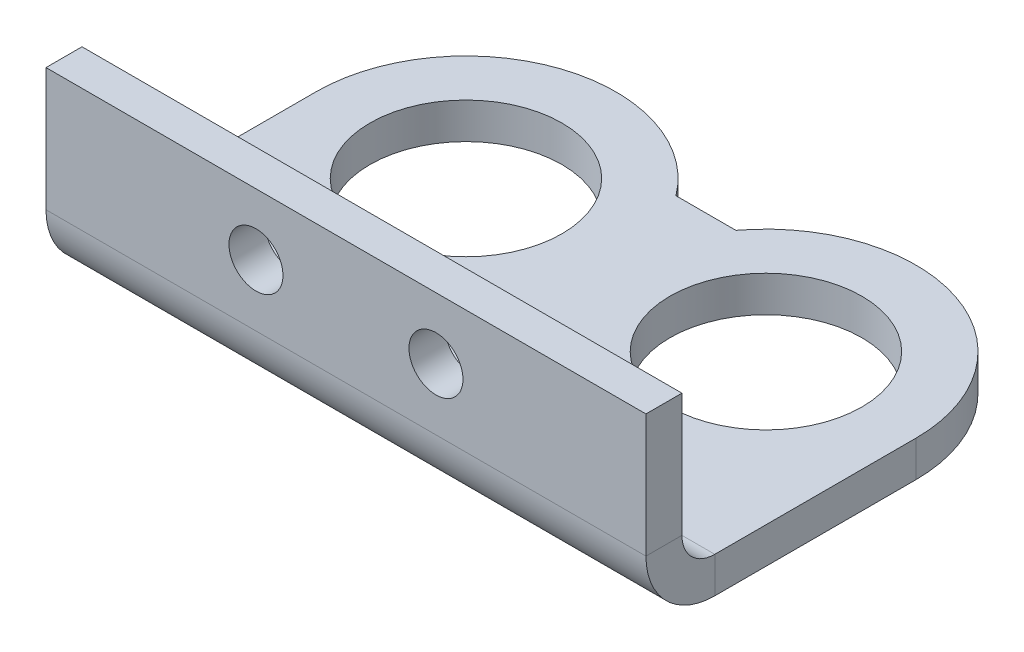
ISO-10303-21;
HEADER;
FILE_DESCRIPTION(('STEP AP214'),'2;1');
FILE_NAME('part.step','',(''),(''),'','','');
FILE_SCHEMA(('AUTOMOTIVE_DESIGN { 1 0 10303 214 1 1 1 1 }'));
ENDSEC;
DATA;
#1=APPLICATION_CONTEXT('core data for automotive mechanical design processes');
#2=APPLICATION_PROTOCOL_DEFINITION('international standard','automotive_design',2000,#1);
#3=PRODUCT_CONTEXT('',#1,'mechanical');
#4=PRODUCT('Part','Part','',(#3));
#5=PRODUCT_RELATED_PRODUCT_CATEGORY('part','',(#4));
#6=PRODUCT_DEFINITION_FORMATION('','',#4);
#7=PRODUCT_DEFINITION_CONTEXT('part definition',#1,'design');
#8=PRODUCT_DEFINITION('design','',#6,#7);
#9=PRODUCT_DEFINITION_SHAPE('','',#8);
#10=(LENGTH_UNIT() NAMED_UNIT(*) SI_UNIT(.MILLI.,.METRE.));
#11=(NAMED_UNIT(*) PLANE_ANGLE_UNIT() SI_UNIT($,.RADIAN.));
#12=(NAMED_UNIT(*) SI_UNIT($,.STERADIAN.) SOLID_ANGLE_UNIT());
#13=UNCERTAINTY_MEASURE_WITH_UNIT(LENGTH_MEASURE(1.E-05),#10,'distance_accuracy_value','');
#14=(GEOMETRIC_REPRESENTATION_CONTEXT(3) GLOBAL_UNCERTAINTY_ASSIGNED_CONTEXT((#13)) GLOBAL_UNIT_ASSIGNED_CONTEXT((#10,
#11,#12)) REPRESENTATION_CONTEXT('',''));
#15=CARTESIAN_POINT('',(0.,0.,0.));
#16=DIRECTION('',(0.,0.,1.));
#17=DIRECTION('',(1.,0.,0.));
#18=AXIS2_PLACEMENT_3D('',#15,#16,#17);
#19=CARTESIAN_POINT('',(25.,-3.,-22.5));
#20=DIRECTION('',(1.,0.,0.));
#21=DIRECTION('',(0.,0.,-1.));
#22=AXIS2_PLACEMENT_3D('',#19,#20,#21);
#23=PLANE('',#22);
#24=DIRECTION('',(0.,0.,-1.));
#25=VECTOR('',#24,1.);
#26=CARTESIAN_POINT('',(25.,0.,-22.5));
#27=LINE('',#26,#25);
#28=CARTESIAN_POINT('',(25.,0.,-5.7366));
#29=VERTEX_POINT('',#28);
#30=CARTESIAN_POINT('',(25.,0.,-22.5));
#31=VERTEX_POINT('',#30);
#32=EDGE_CURVE('E242',#29,#31,#27,.T.);
#33=ORIENTED_EDGE('',*,*,#32,.F.);
#34=DIRECTION('',(0.,-1.,0.));
#35=VECTOR('',#34,1.);
#36=CARTESIAN_POINT('',(25.,0.,-5.73659999999999));
#37=LINE('',#36,#35);
#38=CARTESIAN_POINT('',(25.,-3.00000000000001,-5.73659999999999));
#39=VERTEX_POINT('',#38);
#40=EDGE_CURVE('E202',#29,#39,#37,.T.);
#41=ORIENTED_EDGE('',*,*,#40,.T.);
#42=DIRECTION('',(0.,0.,-1.));
#43=VECTOR('',#42,1.);
#44=CARTESIAN_POINT('',(25.,-3.,-22.5));
#45=LINE('',#44,#43);
#46=CARTESIAN_POINT('',(25.,-3.,-22.5));
#47=VERTEX_POINT('',#46);
#48=EDGE_CURVE('E231',#39,#47,#45,.T.);
#49=ORIENTED_EDGE('',*,*,#48,.T.);
#50=DIRECTION('',(0.,1.,0.));
#51=VECTOR('',#50,1.);
#52=CARTESIAN_POINT('',(25.,-3.,-22.5));
#53=LINE('',#52,#51);
#54=EDGE_CURVE('E250',#47,#31,#53,.T.);
#55=ORIENTED_EDGE('',*,*,#54,.T.);
#56=EDGE_LOOP('',(#33,#41,#49,#55));
#57=FACE_BOUND('',#56,.T.);
#58=ADVANCED_FACE('F57',(#57),#23,.T.);
#59=CARTESIAN_POINT('',(-12.5,-3.,-22.5));
#60=DIRECTION('',(0.,1.,0.));
#61=DIRECTION('',(0.,0.,1.));
#62=AXIS2_PLACEMENT_3D('',#59,#60,#61);
#63=PLANE('',#62);
#64=CARTESIAN_POINT('',(-12.5,-3.,-22.5));
#65=DIRECTION('',(0.,1.,0.));
#66=DIRECTION('',(0.,0.,1.));
#67=AXIS2_PLACEMENT_3D('',#64,#65,#66);
#68=CIRCLE('',#67,8.);
#69=CARTESIAN_POINT('',(-12.5,-3.,-14.5));
#70=VERTEX_POINT('',#69);
#71=EDGE_CURVE('E220',#70,#70,#68,.T.);
#72=ORIENTED_EDGE('',*,*,#71,.T.);
#73=EDGE_LOOP('',(#72));
#74=FACE_BOUND('',#73,.T.);
#75=CARTESIAN_POINT('',(12.5,-3.,-22.5));
#76=DIRECTION('',(0.,1.,0.));
#77=DIRECTION('',(0.,0.,-1.));
#78=AXIS2_PLACEMENT_3D('',#75,#76,#77);
#79=CIRCLE('',#78,8.);
#80=CARTESIAN_POINT('',(12.5,-3.,-30.5));
#81=VERTEX_POINT('',#80);
#82=EDGE_CURVE('E214',#81,#81,#79,.T.);
#83=ORIENTED_EDGE('',*,*,#82,.T.);
#84=EDGE_LOOP('',(#83));
#85=FACE_BOUND('',#84,.T.);
#86=DIRECTION('',(1.,0.,0.));
#87=VECTOR('',#86,1.);
#88=CARTESIAN_POINT('',(25.,-3.00000000000001,-5.73659999999999));
#89=LINE('',#88,#87);
#90=CARTESIAN_POINT('',(-25.,-3.,-5.73659999999999));
#91=VERTEX_POINT('',#90);
#92=EDGE_CURVE('E151',#39,#91,#89,.F.);
#93=ORIENTED_EDGE('',*,*,#92,.T.);
#94=DIRECTION('',(0.,0.,1.));
#95=VECTOR('',#94,1.);
#96=CARTESIAN_POINT('',(-25.,-3.,-22.5));
#97=LINE('',#96,#95);
#98=CARTESIAN_POINT('',(-25.,-3.,-22.5));
#99=VERTEX_POINT('',#98);
#100=EDGE_CURVE('E228',#99,#91,#97,.T.);
#101=ORIENTED_EDGE('',*,*,#100,.F.);
#102=CARTESIAN_POINT('',(-12.5,-3.,-22.5));
#103=DIRECTION('',(0.,1.,0.));
#104=DIRECTION('',(0.,0.,1.));
#105=AXIS2_PLACEMENT_3D('',#102,#103,#104);
#106=CIRCLE('',#105,12.5);
#107=CARTESIAN_POINT('',(-2.5,-3.,-30.));
#108=VERTEX_POINT('',#107);
#109=EDGE_CURVE('E226',#108,#99,#106,.T.);
#110=ORIENTED_EDGE('',*,*,#109,.F.);
#111=DIRECTION('',(-1.,0.,0.));
#112=VECTOR('',#111,1.);
#113=CARTESIAN_POINT('',(-2.5,-3.,-30.));
#114=LINE('',#113,#112);
#115=CARTESIAN_POINT('',(2.5,-3.,-30.));
#116=VERTEX_POINT('',#115);
#117=EDGE_CURVE('E236',#116,#108,#114,.T.);
#118=ORIENTED_EDGE('',*,*,#117,.F.);
#119=CARTESIAN_POINT('',(12.5,-3.,-22.5));
#120=DIRECTION('',(0.,1.,0.));
#121=DIRECTION('',(0.,0.,-1.));
#122=AXIS2_PLACEMENT_3D('',#119,#120,#121);
#123=CIRCLE('',#122,12.5);
#124=EDGE_CURVE('E233',#47,#116,#123,.T.);
#125=ORIENTED_EDGE('',*,*,#124,.F.);
#126=ORIENTED_EDGE('',*,*,#48,.F.);
#127=EDGE_LOOP('',(#93,#101,#110,#118,#125,#126));
#128=FACE_BOUND('',#127,.T.);
#129=ADVANCED_FACE('F289',(#74,#85,#128),#63,.F.);
#130=CARTESIAN_POINT('',(-12.5,0.,-22.5));
#131=DIRECTION('',(0.,1.,0.));
#132=DIRECTION('',(0.,0.,1.));
#133=AXIS2_PLACEMENT_3D('',#130,#131,#132);
#134=PLANE('',#133);
#135=CARTESIAN_POINT('',(12.5,0.,-22.5));
#136=DIRECTION('',(0.,1.,0.));
#137=DIRECTION('',(0.,0.,-1.));
#138=AXIS2_PLACEMENT_3D('',#135,#136,#137);
#139=CIRCLE('',#138,8.);
#140=CARTESIAN_POINT('',(12.5,0.,-30.5));
#141=VERTEX_POINT('',#140);
#142=EDGE_CURVE('E211',#141,#141,#139,.T.);
#143=ORIENTED_EDGE('',*,*,#142,.F.);
#144=EDGE_LOOP('',(#143));
#145=FACE_BOUND('',#144,.T.);
#146=CARTESIAN_POINT('',(-12.5,0.,-22.5));
#147=DIRECTION('',(0.,1.,0.));
#148=DIRECTION('',(0.,0.,1.));
#149=AXIS2_PLACEMENT_3D('',#146,#147,#148);
#150=CIRCLE('',#149,8.);
#151=CARTESIAN_POINT('',(-12.5,0.,-14.5));
#152=VERTEX_POINT('',#151);
#153=EDGE_CURVE('E217',#152,#152,#150,.T.);
#154=ORIENTED_EDGE('',*,*,#153,.F.);
#155=EDGE_LOOP('',(#154));
#156=FACE_BOUND('',#155,.T.);
#157=DIRECTION('',(0.,0.,1.));
#158=VECTOR('',#157,1.);
#159=CARTESIAN_POINT('',(-25.,0.,-22.5));
#160=LINE('',#159,#158);
#161=CARTESIAN_POINT('',(-25.,0.,-22.5));
#162=VERTEX_POINT('',#161);
#163=CARTESIAN_POINT('',(-25.,0.,-5.73659999999999));
#164=VERTEX_POINT('',#163);
#165=EDGE_CURVE('E240',#162,#164,#160,.T.);
#166=ORIENTED_EDGE('',*,*,#165,.T.);
#167=DIRECTION('',(1.,0.,0.));
#168=VECTOR('',#167,1.);
#169=CARTESIAN_POINT('',(25.,0.,-5.73659999999999));
#170=LINE('',#169,#168);
#171=EDGE_CURVE('E74',#29,#164,#170,.F.);
#172=ORIENTED_EDGE('',*,*,#171,.F.);
#173=ORIENTED_EDGE('',*,*,#32,.T.);
#174=CARTESIAN_POINT('',(12.5,0.,-22.5));
#175=DIRECTION('',(0.,1.,0.));
#176=DIRECTION('',(0.,0.,-1.));
#177=AXIS2_PLACEMENT_3D('',#174,#175,#176);
#178=CIRCLE('',#177,12.5);
#179=CARTESIAN_POINT('',(2.5,0.,-30.));
#180=VERTEX_POINT('',#179);
#181=EDGE_CURVE('E244',#31,#180,#178,.T.);
#182=ORIENTED_EDGE('',*,*,#181,.T.);
#183=DIRECTION('',(-1.,0.,0.));
#184=VECTOR('',#183,1.);
#185=CARTESIAN_POINT('',(-2.5,0.,-30.));
#186=LINE('',#185,#184);
#187=CARTESIAN_POINT('',(-2.5,0.,-30.));
#188=VERTEX_POINT('',#187);
#189=EDGE_CURVE('E229',#180,#188,#186,.T.);
#190=ORIENTED_EDGE('',*,*,#189,.T.);
#191=CARTESIAN_POINT('',(-12.5,0.,-22.5));
#192=DIRECTION('',(0.,1.,0.));
#193=DIRECTION('',(0.,0.,1.));
#194=AXIS2_PLACEMENT_3D('',#191,#192,#193);
#195=CIRCLE('',#194,12.5);
#196=EDGE_CURVE('E223',#188,#162,#195,.T.);
#197=ORIENTED_EDGE('',*,*,#196,.T.);
#198=EDGE_LOOP('',(#166,#172,#173,#182,#190,#197));
#199=FACE_BOUND('',#198,.T.);
#200=ADVANCED_FACE('F295',(#145,#156,#199),#134,.T.);
#201=CARTESIAN_POINT('',(-12.5,-3.,-22.5));
#202=DIRECTION('',(0.,1.,0.));
#203=DIRECTION('',(0.,0.,1.));
#204=AXIS2_PLACEMENT_3D('',#201,#202,#203);
#205=CYLINDRICAL_SURFACE('',#204,12.5);
#206=ORIENTED_EDGE('',*,*,#196,.F.);
#207=DIRECTION('',(0.,1.,0.));
#208=VECTOR('',#207,1.);
#209=CARTESIAN_POINT('',(-2.5,-3.,-30.));
#210=LINE('',#209,#208);
#211=EDGE_CURVE('E13',#108,#188,#210,.T.);
#212=ORIENTED_EDGE('',*,*,#211,.F.);
#213=ORIENTED_EDGE('',*,*,#109,.T.);
#214=DIRECTION('',(0.,1.,0.));
#215=VECTOR('',#214,1.);
#216=CARTESIAN_POINT('',(-25.,-3.,-22.5));
#217=LINE('',#216,#215);
#218=EDGE_CURVE('E106',#99,#162,#217,.T.);
#219=ORIENTED_EDGE('',*,*,#218,.T.);
#220=EDGE_LOOP('',(#206,#212,#213,#219));
#221=FACE_BOUND('',#220,.T.);
#222=ADVANCED_FACE('F59',(#221),#205,.T.);
#223=CARTESIAN_POINT('',(-2.5,-3.,-30.));
#224=DIRECTION('',(0.,0.,-1.));
#225=DIRECTION('',(-1.,0.,0.));
#226=AXIS2_PLACEMENT_3D('',#223,#224,#225);
#227=PLANE('',#226);
#228=ORIENTED_EDGE('',*,*,#189,.F.);
#229=DIRECTION('',(0.,1.,0.));
#230=VECTOR('',#229,1.);
#231=CARTESIAN_POINT('',(2.5,-3.,-30.));
#232=LINE('',#231,#230);
#233=EDGE_CURVE('E66',#116,#180,#232,.T.);
#234=ORIENTED_EDGE('',*,*,#233,.F.);
#235=ORIENTED_EDGE('',*,*,#117,.T.);
#236=ORIENTED_EDGE('',*,*,#211,.T.);
#237=EDGE_LOOP('',(#228,#234,#235,#236));
#238=FACE_BOUND('',#237,.T.);
#239=ADVANCED_FACE('F311',(#238),#227,.T.);
#240=CARTESIAN_POINT('',(12.5,-3.,-22.5));
#241=DIRECTION('',(0.,1.,0.));
#242=DIRECTION('',(0.,0.,1.));
#243=AXIS2_PLACEMENT_3D('',#240,#241,#242);
#244=CYLINDRICAL_SURFACE('',#243,12.5);
#245=ORIENTED_EDGE('',*,*,#181,.F.);
#246=ORIENTED_EDGE('',*,*,#54,.F.);
#247=ORIENTED_EDGE('',*,*,#124,.T.);
#248=ORIENTED_EDGE('',*,*,#233,.T.);
#249=EDGE_LOOP('',(#245,#246,#247,#248));
#250=FACE_BOUND('',#249,.T.);
#251=ADVANCED_FACE('F299',(#250),#244,.T.);
#252=CARTESIAN_POINT('',(-25.,-3.,-22.5));
#253=DIRECTION('',(-1.,0.,0.));
#254=DIRECTION('',(0.,0.,1.));
#255=AXIS2_PLACEMENT_3D('',#252,#253,#254);
#256=PLANE('',#255);
#257=DIRECTION('',(0.,-1.,0.));
#258=VECTOR('',#257,1.);
#259=CARTESIAN_POINT('',(-25.,0.,-5.73659999999999));
#260=LINE('',#259,#258);
#261=EDGE_CURVE('E208',#164,#91,#260,.T.);
#262=ORIENTED_EDGE('',*,*,#261,.F.);
#263=ORIENTED_EDGE('',*,*,#165,.F.);
#264=ORIENTED_EDGE('',*,*,#218,.F.);
#265=ORIENTED_EDGE('',*,*,#100,.T.);
#266=EDGE_LOOP('',(#262,#263,#264,#265));
#267=FACE_BOUND('',#266,.T.);
#268=ADVANCED_FACE('F301',(#267),#256,.T.);
#269=CARTESIAN_POINT('',(-12.5,-3.,-22.5));
#270=DIRECTION('',(0.,1.,0.));
#271=DIRECTION('',(0.,0.,1.));
#272=AXIS2_PLACEMENT_3D('',#269,#270,#271);
#273=CYLINDRICAL_SURFACE('',#272,8.);
#274=ORIENTED_EDGE('',*,*,#71,.F.);
#275=EDGE_LOOP('',(#274));
#276=FACE_BOUND('',#275,.T.);
#277=ORIENTED_EDGE('',*,*,#153,.T.);
#278=EDGE_LOOP('',(#277));
#279=FACE_BOUND('',#278,.T.);
#280=ADVANCED_FACE('F303',(#276,#279),#273,.F.);
#281=CARTESIAN_POINT('',(12.5,-3.,-22.5));
#282=DIRECTION('',(0.,1.,0.));
#283=DIRECTION('',(0.,0.,1.));
#284=AXIS2_PLACEMENT_3D('',#281,#282,#283);
#285=CYLINDRICAL_SURFACE('',#284,8.);
#286=ORIENTED_EDGE('',*,*,#82,.F.);
#287=EDGE_LOOP('',(#286));
#288=FACE_BOUND('',#287,.T.);
#289=ORIENTED_EDGE('',*,*,#142,.T.);
#290=EDGE_LOOP('',(#289));
#291=FACE_BOUND('',#290,.T.);
#292=ADVANCED_FACE('F308',(#288,#291),#285,.F.);
#293=CARTESIAN_POINT('',(-25.,2.73659999999999,-5.73659999999999));
#294=DIRECTION('',(-1.,0.,0.));
#295=DIRECTION('',(0.,0.,1.));
#296=AXIS2_PLACEMENT_3D('',#293,#294,#295);
#297=PLANE('',#296);
#298=DIRECTION('',(0.,0.,1.));
#299=VECTOR('',#298,1.);
#300=CARTESIAN_POINT('',(-25.,2.73659999999999,0.));
#301=LINE('',#300,#299);
#302=CARTESIAN_POINT('',(-25.,2.73659999999998,-2.99999999999999));
#303=VERTEX_POINT('',#302);
#304=CARTESIAN_POINT('',(-25.,2.73659999999997,0.));
#305=VERTEX_POINT('',#304);
#306=EDGE_CURVE('E196',#303,#305,#301,.T.);
#307=ORIENTED_EDGE('',*,*,#306,.F.);
#308=CARTESIAN_POINT('',(-25.,2.73659999999999,-5.73659999999999));
#309=DIRECTION('',(1.,0.,0.));
#310=DIRECTION('',(0.,0.,-1.));
#311=AXIS2_PLACEMENT_3D('',#308,#309,#310);
#312=CIRCLE('',#311,2.7366);
#313=EDGE_CURVE('E154',#164,#303,#312,.F.);
#314=ORIENTED_EDGE('',*,*,#313,.F.);
#315=ORIENTED_EDGE('',*,*,#261,.T.);
#316=CARTESIAN_POINT('',(-25.,2.73659999999999,-5.73659999999999));
#317=DIRECTION('',(1.,0.,0.));
#318=DIRECTION('',(0.,0.,-1.));
#319=AXIS2_PLACEMENT_3D('',#316,#317,#318);
#320=CIRCLE('',#319,5.7366);
#321=EDGE_CURVE('E201',#91,#305,#320,.F.);
#322=ORIENTED_EDGE('',*,*,#321,.T.);
#323=EDGE_LOOP('',(#307,#314,#315,#322));
#324=FACE_BOUND('',#323,.T.);
#325=ADVANCED_FACE('F276',(#324),#297,.T.);
#326=CARTESIAN_POINT('',(25.,2.73659999999999,-5.73659999999999));
#327=DIRECTION('',(-1.,0.,0.));
#328=DIRECTION('',(0.,0.,1.));
#329=AXIS2_PLACEMENT_3D('',#326,#327,#328);
#330=PLANE('',#329);
#331=CARTESIAN_POINT('',(25.,2.73659999999999,-5.73659999999999));
#332=DIRECTION('',(1.,0.,0.));
#333=DIRECTION('',(0.,0.,-1.));
#334=AXIS2_PLACEMENT_3D('',#331,#332,#333);
#335=CIRCLE('',#334,2.7366);
#336=CARTESIAN_POINT('',(25.,2.73659999999998,-2.99999999999999));
#337=VERTEX_POINT('',#336);
#338=EDGE_CURVE('E161',#337,#29,#335,.T.);
#339=ORIENTED_EDGE('',*,*,#338,.F.);
#340=DIRECTION('',(0.,0.,1.));
#341=VECTOR('',#340,1.);
#342=CARTESIAN_POINT('',(25.,2.73659999999999,-2.99999999999999));
#343=LINE('',#342,#341);
#344=CARTESIAN_POINT('',(25.,2.73659999999999,0.));
#345=VERTEX_POINT('',#344);
#346=EDGE_CURVE('E158',#337,#345,#343,.T.);
#347=ORIENTED_EDGE('',*,*,#346,.T.);
#348=CARTESIAN_POINT('',(25.,2.73659999999999,-5.73659999999999));
#349=DIRECTION('',(1.,0.,0.));
#350=DIRECTION('',(0.,0.,-1.));
#351=AXIS2_PLACEMENT_3D('',#348,#349,#350);
#352=CIRCLE('',#351,5.7366);
#353=EDGE_CURVE('E144',#345,#39,#352,.T.);
#354=ORIENTED_EDGE('',*,*,#353,.T.);
#355=ORIENTED_EDGE('',*,*,#40,.F.);
#356=EDGE_LOOP('',(#339,#347,#354,#355));
#357=FACE_BOUND('',#356,.T.);
#358=ADVANCED_FACE('F159',(#357),#330,.F.);
#359=CARTESIAN_POINT('',(25.,2.73659999999999,-5.73659999999999));
#360=DIRECTION('',(1.,0.,0.));
#361=DIRECTION('',(0.,0.,1.));
#362=AXIS2_PLACEMENT_3D('',#359,#360,#361);
#363=CYLINDRICAL_SURFACE('',#362,5.7366);
#364=ORIENTED_EDGE('',*,*,#92,.F.);
#365=ORIENTED_EDGE('',*,*,#353,.F.);
#366=DIRECTION('',(1.,0.,0.));
#367=VECTOR('',#366,1.);
#368=CARTESIAN_POINT('',(0.,2.73659999999999,0.));
#369=LINE('',#368,#367);
#370=EDGE_CURVE('E149',#305,#345,#369,.T.);
#371=ORIENTED_EDGE('',*,*,#370,.F.);
#372=ORIENTED_EDGE('',*,*,#321,.F.);
#373=EDGE_LOOP('',(#364,#365,#371,#372));
#374=FACE_BOUND('',#373,.T.);
#375=ADVANCED_FACE('F146',(#374),#363,.T.);
#376=CARTESIAN_POINT('',(25.,2.73659999999999,-5.73659999999999));
#377=DIRECTION('',(1.,0.,0.));
#378=DIRECTION('',(0.,0.,1.));
#379=AXIS2_PLACEMENT_3D('',#376,#377,#378);
#380=CYLINDRICAL_SURFACE('',#379,2.7366);
#381=ORIENTED_EDGE('',*,*,#171,.T.);
#382=ORIENTED_EDGE('',*,*,#313,.T.);
#383=DIRECTION('',(-1.,0.,0.));
#384=VECTOR('',#383,1.);
#385=CARTESIAN_POINT('',(-25.,2.73659999999999,-2.99999999999999));
#386=LINE('',#385,#384);
#387=EDGE_CURVE('E166',#303,#337,#386,.F.);
#388=ORIENTED_EDGE('',*,*,#387,.T.);
#389=ORIENTED_EDGE('',*,*,#338,.T.);
#390=EDGE_LOOP('',(#381,#382,#388,#389));
#391=FACE_BOUND('',#390,.T.);
#392=ADVANCED_FACE('F278',(#391),#380,.F.);
#393=CARTESIAN_POINT('',(25.,0.,0.));
#394=DIRECTION('',(1.,0.,0.));
#395=DIRECTION('',(0.,1.,0.));
#396=AXIS2_PLACEMENT_3D('',#393,#394,#395);
#397=PLANE('',#396);
#398=DIRECTION('',(0.,-1.,0.));
#399=VECTOR('',#398,1.);
#400=CARTESIAN_POINT('',(25.,0.,0.));
#401=LINE('',#400,#399);
#402=CARTESIAN_POINT('',(25.,13.,0.));
#403=VERTEX_POINT('',#402);
#404=EDGE_CURVE('E173',#403,#345,#401,.T.);
#405=ORIENTED_EDGE('',*,*,#404,.T.);
#406=ORIENTED_EDGE('',*,*,#346,.F.);
#407=DIRECTION('',(0.,1.,0.));
#408=VECTOR('',#407,1.);
#409=CARTESIAN_POINT('',(25.,0.,-3.));
#410=LINE('',#409,#408);
#411=CARTESIAN_POINT('',(25.,13.,-2.99999999999995));
#412=VERTEX_POINT('',#411);
#413=EDGE_CURVE('E189',#412,#337,#410,.F.);
#414=ORIENTED_EDGE('',*,*,#413,.F.);
#415=DIRECTION('',(0.,0.,-1.));
#416=VECTOR('',#415,1.);
#417=CARTESIAN_POINT('',(25.,13.,0.));
#418=LINE('',#417,#416);
#419=EDGE_CURVE('E178',#403,#412,#418,.T.);
#420=ORIENTED_EDGE('',*,*,#419,.F.);
#421=EDGE_LOOP('',(#405,#406,#414,#420));
#422=FACE_BOUND('',#421,.T.);
#423=ADVANCED_FACE('F177',(#422),#397,.T.);
#424=CARTESIAN_POINT('',(-25.,13.,0.));
#425=DIRECTION('',(-1.,0.,0.));
#426=DIRECTION('',(0.,-1.,0.));
#427=AXIS2_PLACEMENT_3D('',#424,#425,#426);
#428=PLANE('',#427);
#429=DIRECTION('',(0.,-1.,0.));
#430=VECTOR('',#429,1.);
#431=CARTESIAN_POINT('',(-25.,0.,-3.));
#432=LINE('',#431,#430);
#433=CARTESIAN_POINT('',(-25.,13.,-2.99999999999995));
#434=VERTEX_POINT('',#433);
#435=EDGE_CURVE('E175',#303,#434,#432,.F.);
#436=ORIENTED_EDGE('',*,*,#435,.F.);
#437=ORIENTED_EDGE('',*,*,#306,.T.);
#438=DIRECTION('',(0.,1.,0.));
#439=VECTOR('',#438,1.);
#440=CARTESIAN_POINT('',(-25.,13.,0.));
#441=LINE('',#440,#439);
#442=CARTESIAN_POINT('',(-25.,13.,0.));
#443=VERTEX_POINT('',#442);
#444=EDGE_CURVE('E174',#305,#443,#441,.T.);
#445=ORIENTED_EDGE('',*,*,#444,.T.);
#446=DIRECTION('',(0.,0.,-1.));
#447=VECTOR('',#446,1.);
#448=CARTESIAN_POINT('',(-25.,13.,0.));
#449=LINE('',#448,#447);
#450=EDGE_CURVE('E180',#443,#434,#449,.T.);
#451=ORIENTED_EDGE('',*,*,#450,.T.);
#452=EDGE_LOOP('',(#436,#437,#445,#451));
#453=FACE_BOUND('',#452,.T.);
#454=ADVANCED_FACE('F273',(#453),#428,.T.);
#455=CARTESIAN_POINT('',(0.,0.,0.));
#456=DIRECTION('',(0.,0.,1.));
#457=DIRECTION('',(0.,-1.,0.));
#458=AXIS2_PLACEMENT_3D('',#455,#456,#457);
#459=PLANE('',#458);
#460=CARTESIAN_POINT('',(-7.5,7.86829999999999,0.));
#461=DIRECTION('',(0.,0.,1.));
#462=DIRECTION('',(-1.,0.,0.));
#463=AXIS2_PLACEMENT_3D('',#460,#461,#462);
#464=CIRCLE('',#463,2.25);
#465=CARTESIAN_POINT('',(-9.75,7.86829999999999,0.));
#466=VERTEX_POINT('',#465);
#467=EDGE_CURVE('E262',#466,#466,#464,.T.);
#468=ORIENTED_EDGE('',*,*,#467,.F.);
#469=EDGE_LOOP('',(#468));
#470=FACE_BOUND('',#469,.T.);
#471=CARTESIAN_POINT('',(7.5,7.86829999999999,0.));
#472=DIRECTION('',(0.,0.,1.));
#473=DIRECTION('',(1.,0.,0.));
#474=AXIS2_PLACEMENT_3D('',#471,#472,#473);
#475=CIRCLE('',#474,2.25);
#476=CARTESIAN_POINT('',(9.75,7.86829999999999,0.));
#477=VERTEX_POINT('',#476);
#478=EDGE_CURVE('E254',#477,#477,#475,.T.);
#479=ORIENTED_EDGE('',*,*,#478,.F.);
#480=EDGE_LOOP('',(#479));
#481=FACE_BOUND('',#480,.T.);
#482=ORIENTED_EDGE('',*,*,#444,.F.);
#483=ORIENTED_EDGE('',*,*,#370,.T.);
#484=ORIENTED_EDGE('',*,*,#404,.F.);
#485=DIRECTION('',(1.,0.,0.));
#486=VECTOR('',#485,1.);
#487=CARTESIAN_POINT('',(25.,13.,0.));
#488=LINE('',#487,#486);
#489=EDGE_CURVE('E181',#443,#403,#488,.T.);
#490=ORIENTED_EDGE('',*,*,#489,.F.);
#491=EDGE_LOOP('',(#482,#483,#484,#490));
#492=FACE_BOUND('',#491,.T.);
#493=ADVANCED_FACE('F171',(#470,#481,#492),#459,.T.);
#494=CARTESIAN_POINT('',(0.,0.,-3.));
#495=DIRECTION('',(0.,0.,1.));
#496=DIRECTION('',(0.,-1.,0.));
#497=AXIS2_PLACEMENT_3D('',#494,#495,#496);
#498=PLANE('',#497);
#499=CARTESIAN_POINT('',(-7.5,7.86829999999999,-2.99999999999997));
#500=DIRECTION('',(0.,0.,1.));
#501=DIRECTION('',(0.,-1.,0.));
#502=AXIS2_PLACEMENT_3D('',#499,#500,#501);
#503=CIRCLE('',#502,2.25);
#504=CARTESIAN_POINT('',(-7.5,5.61829999999999,-2.99999999999998));
#505=VERTEX_POINT('',#504);
#506=EDGE_CURVE('E61',#505,#505,#503,.T.);
#507=ORIENTED_EDGE('',*,*,#506,.T.);
#508=EDGE_LOOP('',(#507));
#509=FACE_BOUND('',#508,.T.);
#510=CARTESIAN_POINT('',(7.5,7.86829999999999,-2.99999999999997));
#511=DIRECTION('',(0.,0.,1.));
#512=DIRECTION('',(0.,-1.,0.));
#513=AXIS2_PLACEMENT_3D('',#510,#511,#512);
#514=CIRCLE('',#513,2.25);
#515=CARTESIAN_POINT('',(7.5,5.61829999999999,-2.99999999999998));
#516=VERTEX_POINT('',#515);
#517=EDGE_CURVE('E199',#516,#516,#514,.T.);
#518=ORIENTED_EDGE('',*,*,#517,.T.);
#519=EDGE_LOOP('',(#518));
#520=FACE_BOUND('',#519,.T.);
#521=ORIENTED_EDGE('',*,*,#387,.F.);
#522=ORIENTED_EDGE('',*,*,#435,.T.);
#523=DIRECTION('',(-1.,0.,0.));
#524=VECTOR('',#523,1.);
#525=CARTESIAN_POINT('',(0.,13.,-2.99999999999995));
#526=LINE('',#525,#524);
#527=EDGE_CURVE('E191',#434,#412,#526,.F.);
#528=ORIENTED_EDGE('',*,*,#527,.T.);
#529=ORIENTED_EDGE('',*,*,#413,.T.);
#530=EDGE_LOOP('',(#521,#522,#528,#529));
#531=FACE_BOUND('',#530,.T.);
#532=ADVANCED_FACE('F270',(#509,#520,#531),#498,.F.);
#533=CARTESIAN_POINT('',(25.,13.,0.));
#534=DIRECTION('',(0.,1.,0.));
#535=DIRECTION('',(0.,0.,1.));
#536=AXIS2_PLACEMENT_3D('',#533,#534,#535);
#537=PLANE('',#536);
#538=ORIENTED_EDGE('',*,*,#527,.F.);
#539=ORIENTED_EDGE('',*,*,#450,.F.);
#540=ORIENTED_EDGE('',*,*,#489,.T.);
#541=ORIENTED_EDGE('',*,*,#419,.T.);
#542=EDGE_LOOP('',(#538,#539,#540,#541));
#543=FACE_BOUND('',#542,.T.);
#544=ADVANCED_FACE('F266',(#543),#537,.T.);
#545=CARTESIAN_POINT('',(7.5,7.86829999999999,-10.));
#546=DIRECTION('',(0.,0.,1.));
#547=DIRECTION('',(1.,0.,0.));
#548=AXIS2_PLACEMENT_3D('',#545,#546,#547);
#549=CYLINDRICAL_SURFACE('',#548,2.25);
#550=ORIENTED_EDGE('',*,*,#478,.T.);
#551=EDGE_LOOP('',(#550));
#552=FACE_BOUND('',#551,.T.);
#553=ORIENTED_EDGE('',*,*,#517,.F.);
#554=EDGE_LOOP('',(#553));
#555=FACE_BOUND('',#554,.T.);
#556=ADVANCED_FACE('F376',(#552,#555),#549,.F.);
#557=CARTESIAN_POINT('',(-7.5,7.86829999999999,-10.));
#558=DIRECTION('',(0.,0.,1.));
#559=DIRECTION('',(1.,0.,0.));
#560=AXIS2_PLACEMENT_3D('',#557,#558,#559);
#561=CYLINDRICAL_SURFACE('',#560,2.25);
#562=ORIENTED_EDGE('',*,*,#467,.T.);
#563=EDGE_LOOP('',(#562));
#564=FACE_BOUND('',#563,.T.);
#565=ORIENTED_EDGE('',*,*,#506,.F.);
#566=EDGE_LOOP('',(#565));
#567=FACE_BOUND('',#566,.T.);
#568=ADVANCED_FACE('F404',(#564,#567),#561,.F.);
#569=CLOSED_SHELL('',(#58,#129,#200,#222,#239,#251,#268,#280,#292,#325,#358,#375,#392,#423,#454,
#493,#532,#544,#556,#568));
#570=MANIFOLD_SOLID_BREP('B2',#569);
#571=ADVANCED_BREP_SHAPE_REPRESENTATION('',(#18,#570),#14);
#572=SHAPE_DEFINITION_REPRESENTATION(#9,#571);
ENDSEC;
END-ISO-10303-21;
